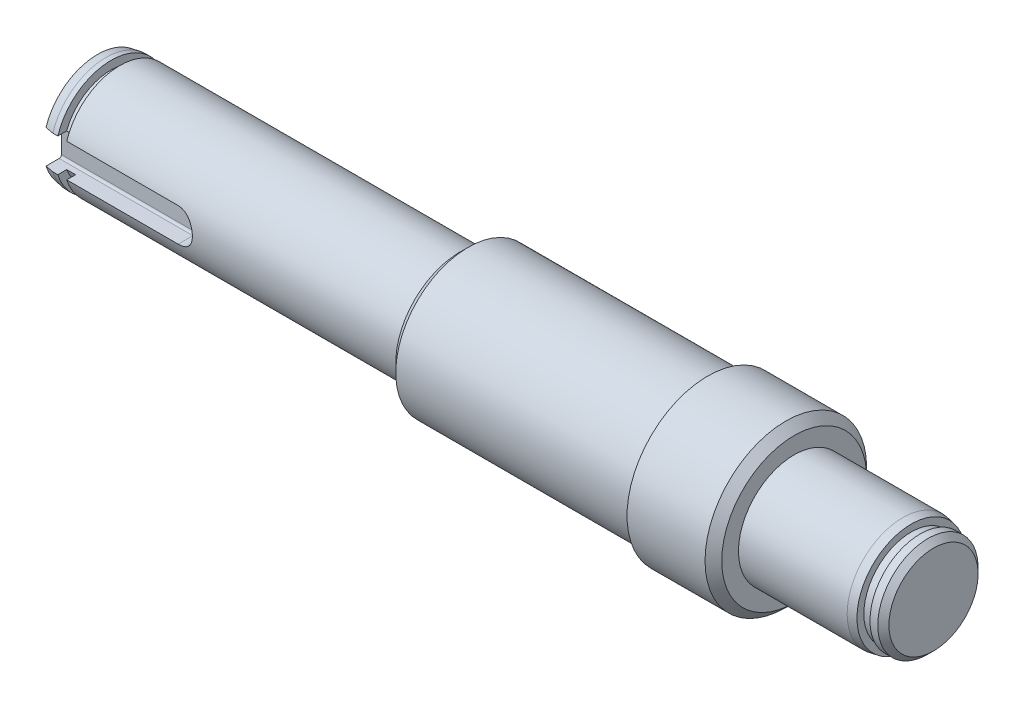
ISO-10303-21;
HEADER;
FILE_DESCRIPTION(('STEP AP214'),'2;1');
FILE_NAME('part.step','',(''),(''),'','','');
FILE_SCHEMA(('AUTOMOTIVE_DESIGN { 1 0 10303 214 1 1 1 1 }'));
ENDSEC;
DATA;
#1=APPLICATION_CONTEXT('core data for automotive mechanical design processes');
#2=APPLICATION_PROTOCOL_DEFINITION('international standard','automotive_design',2000,#1);
#3=PRODUCT_CONTEXT('',#1,'mechanical');
#4=PRODUCT('Part','Part','',(#3));
#5=PRODUCT_RELATED_PRODUCT_CATEGORY('part','',(#4));
#6=PRODUCT_DEFINITION_FORMATION('','',#4);
#7=PRODUCT_DEFINITION_CONTEXT('part definition',#1,'design');
#8=PRODUCT_DEFINITION('design','',#6,#7);
#9=PRODUCT_DEFINITION_SHAPE('','',#8);
#10=(LENGTH_UNIT() NAMED_UNIT(*) SI_UNIT(.MILLI.,.METRE.));
#11=(NAMED_UNIT(*) PLANE_ANGLE_UNIT() SI_UNIT($,.RADIAN.));
#12=(NAMED_UNIT(*) SI_UNIT($,.STERADIAN.) SOLID_ANGLE_UNIT());
#13=UNCERTAINTY_MEASURE_WITH_UNIT(LENGTH_MEASURE(1.E-05),#10,'distance_accuracy_value','');
#14=(GEOMETRIC_REPRESENTATION_CONTEXT(3) GLOBAL_UNCERTAINTY_ASSIGNED_CONTEXT((#13)) GLOBAL_UNIT_ASSIGNED_CONTEXT((#10,
#11,#12)) REPRESENTATION_CONTEXT('',''));
#15=CARTESIAN_POINT('',(0.,0.,0.));
#16=DIRECTION('',(0.,0.,1.));
#17=DIRECTION('',(1.,0.,0.));
#18=AXIS2_PLACEMENT_3D('',#15,#16,#17);
#19=CARTESIAN_POINT('',(30.,13.,0.));
#20=DIRECTION('',(-1.,0.,0.));
#21=DIRECTION('',(0.,0.,1.));
#22=AXIS2_PLACEMENT_3D('',#19,#20,#21);
#23=PLANE('',#22);
#24=CARTESIAN_POINT('',(30.,0.,0.));
#25=DIRECTION('',(-1.,0.,0.));
#26=DIRECTION('',(0.,0.,1.));
#27=AXIS2_PLACEMENT_3D('',#24,#25,#26);
#28=CIRCLE('',#27,13.);
#29=CARTESIAN_POINT('',(30.,0.,13.));
#30=VERTEX_POINT('',#29);
#31=EDGE_CURVE('E299',#30,#30,#28,.F.);
#32=ORIENTED_EDGE('',*,*,#31,.T.);
#33=EDGE_LOOP('',(#32));
#34=FACE_BOUND('',#33,.T.);
#35=CARTESIAN_POINT('',(30.,0.,0.));
#36=DIRECTION('',(-1.,0.,0.));
#37=DIRECTION('',(0.,0.,1.));
#38=AXIS2_PLACEMENT_3D('',#35,#36,#37);
#39=CIRCLE('',#38,10.);
#40=CARTESIAN_POINT('',(30.,0.,10.));
#41=VERTEX_POINT('',#40);
#42=EDGE_CURVE('E238',#41,#41,#39,.T.);
#43=ORIENTED_EDGE('',*,*,#42,.T.);
#44=EDGE_LOOP('',(#43));
#45=FACE_BOUND('',#44,.T.);
#46=ADVANCED_FACE('F38',(#34,#45),#23,.F.);
#47=CARTESIAN_POINT('',(0.,0.,0.));
#48=DIRECTION('',(-1.,0.,0.));
#49=DIRECTION('',(0.,0.,1.));
#50=AXIS2_PLACEMENT_3D('',#47,#48,#49);
#51=CYLINDRICAL_SURFACE('',#50,10.);
#52=CARTESIAN_POINT('',(49.5,0.,0.));
#53=DIRECTION('',(-1.,0.,0.));
#54=DIRECTION('',(0.,0.,1.));
#55=AXIS2_PLACEMENT_3D('',#52,#53,#54);
#56=CIRCLE('',#55,10.);
#57=CARTESIAN_POINT('',(49.5,0.,10.));
#58=VERTEX_POINT('',#57);
#59=EDGE_CURVE('E241',#58,#58,#56,.T.);
#60=ORIENTED_EDGE('',*,*,#59,.T.);
#61=EDGE_LOOP('',(#60));
#62=FACE_BOUND('',#61,.T.);
#63=ORIENTED_EDGE('',*,*,#42,.F.);
#64=EDGE_LOOP('',(#63));
#65=FACE_BOUND('',#64,.T.);
#66=ADVANCED_FACE('F337',(#62,#65),#51,.T.);
#67=CARTESIAN_POINT('',(51.,10.,0.));
#68=DIRECTION('',(-1.,0.,0.));
#69=DIRECTION('',(0.,0.,1.));
#70=AXIS2_PLACEMENT_3D('',#67,#68,#69);
#71=PLANE('',#70);
#72=CARTESIAN_POINT('',(51.,0.,0.));
#73=DIRECTION('',(-1.,0.,0.));
#74=DIRECTION('',(0.,0.,1.));
#75=AXIS2_PLACEMENT_3D('',#72,#73,#74);
#76=CIRCLE('',#75,9.73550952893732);
#77=CARTESIAN_POINT('',(51.,0.,9.73550952893732));
#78=VERTEX_POINT('',#77);
#79=EDGE_CURVE('E244',#78,#78,#76,.F.);
#80=ORIENTED_EDGE('',*,*,#79,.T.);
#81=EDGE_LOOP('',(#80));
#82=FACE_BOUND('',#81,.T.);
#83=CARTESIAN_POINT('',(51.,0.,0.));
#84=DIRECTION('',(-1.,0.,0.));
#85=DIRECTION('',(0.,0.,1.));
#86=AXIS2_PLACEMENT_3D('',#83,#84,#85);
#87=CIRCLE('',#86,8.5);
#88=CARTESIAN_POINT('',(51.,0.,8.5));
#89=VERTEX_POINT('',#88);
#90=EDGE_CURVE('E227',#89,#89,#87,.T.);
#91=ORIENTED_EDGE('',*,*,#90,.T.);
#92=EDGE_LOOP('',(#91));
#93=FACE_BOUND('',#92,.T.);
#94=ADVANCED_FACE('F343',(#82,#93),#71,.F.);
#95=CARTESIAN_POINT('',(49.5,0.,0.));
#96=DIRECTION('',(-1.,0.,0.));
#97=DIRECTION('',(0.,0.,1.));
#98=AXIS2_PLACEMENT_3D('',#95,#96,#97);
#99=CONICAL_SURFACE('',#98,10.,0.174532925199429);
#100=ORIENTED_EDGE('',*,*,#79,.F.);
#101=EDGE_LOOP('',(#100));
#102=FACE_BOUND('',#101,.T.);
#103=ORIENTED_EDGE('',*,*,#59,.F.);
#104=EDGE_LOOP('',(#103));
#105=FACE_BOUND('',#104,.T.);
#106=ADVANCED_FACE('F355',(#102,#105),#99,.T.);
#107=CARTESIAN_POINT('',(52.6,0.,-8.5));
#108=DIRECTION('',(-1.,0.,0.));
#109=DIRECTION('',(0.,0.,1.));
#110=AXIS2_PLACEMENT_3D('',#107,#108,#109);
#111=PLANE('',#110);
#112=CARTESIAN_POINT('',(52.6,0.,0.));
#113=DIRECTION('',(-1.,0.,0.));
#114=DIRECTION('',(0.,0.,1.));
#115=AXIS2_PLACEMENT_3D('',#112,#113,#114);
#116=CIRCLE('',#115,8.5);
#117=CARTESIAN_POINT('',(52.6,0.,8.5));
#118=VERTEX_POINT('',#117);
#119=EDGE_CURVE('E230',#118,#118,#116,.T.);
#120=ORIENTED_EDGE('',*,*,#119,.F.);
#121=EDGE_LOOP('',(#120));
#122=FACE_BOUND('',#121,.T.);
#123=CARTESIAN_POINT('',(52.6,0.,0.));
#124=DIRECTION('',(-1.,0.,0.));
#125=DIRECTION('',(0.,0.,1.));
#126=AXIS2_PLACEMENT_3D('',#123,#124,#125);
#127=CIRCLE('',#126,9.);
#128=CARTESIAN_POINT('',(52.6,0.,9.));
#129=VERTEX_POINT('',#128);
#130=EDGE_CURVE('E234',#129,#129,#127,.T.);
#131=ORIENTED_EDGE('',*,*,#130,.T.);
#132=EDGE_LOOP('',(#131));
#133=FACE_BOUND('',#132,.T.);
#134=ADVANCED_FACE('F359',(#122,#133),#111,.T.);
#135=CARTESIAN_POINT('',(0.,0.,0.));
#136=DIRECTION('',(-1.,0.,0.));
#137=DIRECTION('',(0.,0.,1.));
#138=AXIS2_PLACEMENT_3D('',#135,#136,#137);
#139=CYLINDRICAL_SURFACE('',#138,8.5);
#140=ORIENTED_EDGE('',*,*,#119,.T.);
#141=EDGE_LOOP('',(#140));
#142=FACE_BOUND('',#141,.T.);
#143=ORIENTED_EDGE('',*,*,#90,.F.);
#144=EDGE_LOOP('',(#143));
#145=FACE_BOUND('',#144,.T.);
#146=ADVANCED_FACE('F365',(#142,#145),#139,.T.);
#147=CARTESIAN_POINT('',(55.,9.,0.));
#148=DIRECTION('',(-1.,0.,0.));
#149=DIRECTION('',(0.,0.,1.));
#150=AXIS2_PLACEMENT_3D('',#147,#148,#149);
#151=PLANE('',#150);
#152=CARTESIAN_POINT('',(55.,0.,0.));
#153=DIRECTION('',(-1.,0.,0.));
#154=DIRECTION('',(0.,0.,1.));
#155=AXIS2_PLACEMENT_3D('',#152,#153,#154);
#156=CIRCLE('',#155,8.00000000000002);
#157=CARTESIAN_POINT('',(55.,0.,8.00000000000002));
#158=VERTEX_POINT('',#157);
#159=EDGE_CURVE('E250',#158,#158,#156,.F.);
#160=ORIENTED_EDGE('',*,*,#159,.T.);
#161=EDGE_LOOP('',(#160));
#162=FACE_BOUND('',#161,.T.);
#163=ADVANCED_FACE('F377',(#162),#151,.F.);
#164=CARTESIAN_POINT('',(54.,0.,0.));
#165=DIRECTION('',(-1.,0.,0.));
#166=DIRECTION('',(0.,0.,1.));
#167=AXIS2_PLACEMENT_3D('',#164,#165,#166);
#168=CONICAL_SURFACE('',#167,9.,0.785398163397454);
#169=ORIENTED_EDGE('',*,*,#159,.F.);
#170=EDGE_LOOP('',(#169));
#171=FACE_BOUND('',#170,.T.);
#172=CARTESIAN_POINT('',(54.,0.,0.));
#173=DIRECTION('',(-1.,0.,0.));
#174=DIRECTION('',(0.,0.,1.));
#175=AXIS2_PLACEMENT_3D('',#172,#173,#174);
#176=CIRCLE('',#175,9.);
#177=CARTESIAN_POINT('',(54.,0.,9.));
#178=VERTEX_POINT('',#177);
#179=EDGE_CURVE('E247',#178,#178,#176,.T.);
#180=ORIENTED_EDGE('',*,*,#179,.F.);
#181=EDGE_LOOP('',(#180));
#182=FACE_BOUND('',#181,.T.);
#183=ADVANCED_FACE('F198',(#171,#182),#168,.T.);
#184=CARTESIAN_POINT('',(0.,0.,0.));
#185=DIRECTION('',(-1.,0.,0.));
#186=DIRECTION('',(0.,0.,1.));
#187=AXIS2_PLACEMENT_3D('',#184,#185,#186);
#188=CYLINDRICAL_SURFACE('',#187,9.);
#189=ORIENTED_EDGE('',*,*,#179,.T.);
#190=EDGE_LOOP('',(#189));
#191=FACE_BOUND('',#190,.T.);
#192=ORIENTED_EDGE('',*,*,#130,.F.);
#193=EDGE_LOOP('',(#192));
#194=FACE_BOUND('',#193,.T.);
#195=ADVANCED_FACE('F411',(#191,#194),#188,.T.);
#196=CARTESIAN_POINT('',(14.5,0.,0.));
#197=DIRECTION('',(1.,0.,0.));
#198=DIRECTION('',(0.,0.,-1.));
#199=AXIS2_PLACEMENT_3D('',#196,#197,#198);
#200=CYLINDRICAL_SURFACE('',#199,14.5);
#201=CARTESIAN_POINT('',(28.5,0.,0.));
#202=DIRECTION('',(-1.,0.,0.));
#203=DIRECTION('',(0.,0.,1.));
#204=AXIS2_PLACEMENT_3D('',#201,#202,#203);
#205=CIRCLE('',#204,14.5);
#206=CARTESIAN_POINT('',(28.5,0.,14.5));
#207=VERTEX_POINT('',#206);
#208=EDGE_CURVE('E294',#207,#207,#205,.T.);
#209=ORIENTED_EDGE('',*,*,#208,.T.);
#210=EDGE_LOOP('',(#209));
#211=FACE_BOUND('',#210,.T.);
#212=CARTESIAN_POINT('',(14.5,0.,0.));
#213=DIRECTION('',(1.,0.,0.));
#214=DIRECTION('',(0.,0.,-1.));
#215=AXIS2_PLACEMENT_3D('',#212,#213,#214);
#216=CIRCLE('',#215,14.5);
#217=CARTESIAN_POINT('',(14.5,0.,-14.5));
#218=VERTEX_POINT('',#217);
#219=EDGE_CURVE('E128',#218,#218,#216,.T.);
#220=ORIENTED_EDGE('',*,*,#219,.T.);
#221=EDGE_LOOP('',(#220));
#222=FACE_BOUND('',#221,.T.);
#223=ADVANCED_FACE('F332',(#211,#222),#200,.T.);
#224=CARTESIAN_POINT('',(14.5,0.,0.));
#225=DIRECTION('',(1.,0.,0.));
#226=DIRECTION('',(0.,0.,-1.));
#227=AXIS2_PLACEMENT_3D('',#224,#225,#226);
#228=PLANE('',#227);
#229=CARTESIAN_POINT('',(14.5,0.,0.));
#230=DIRECTION('',(1.,0.,0.));
#231=DIRECTION('',(0.,0.,-1.));
#232=AXIS2_PLACEMENT_3D('',#229,#230,#231);
#233=CIRCLE('',#232,13.);
#234=CARTESIAN_POINT('',(14.5,0.,-13.));
#235=VERTEX_POINT('',#234);
#236=EDGE_CURVE('E600',#235,#235,#233,.T.);
#237=ORIENTED_EDGE('',*,*,#236,.T.);
#238=EDGE_LOOP('',(#237));
#239=FACE_BOUND('',#238,.T.);
#240=ORIENTED_EDGE('',*,*,#219,.F.);
#241=EDGE_LOOP('',(#240));
#242=FACE_BOUND('',#241,.T.);
#243=ADVANCED_FACE('F326',(#239,#242),#228,.F.);
#244=CARTESIAN_POINT('',(-119.,0.,6.5));
#245=DIRECTION('',(0.,0.,1.));
#246=DIRECTION('',(1.,0.,0.));
#247=AXIS2_PLACEMENT_3D('',#244,#245,#246);
#248=PLANE('',#247);
#249=CARTESIAN_POINT('',(-71.,0.,6.5));
#250=DIRECTION('',(0.,0.,1.));
#251=DIRECTION('',(1.,0.,0.));
#252=AXIS2_PLACEMENT_3D('',#249,#250,#251);
#253=CIRCLE('',#252,2.6);
#254=CARTESIAN_POINT('',(-71.,-2.59999999999999,6.5));
#255=VERTEX_POINT('',#254);
#256=CARTESIAN_POINT('',(-71.,2.6,6.5));
#257=VERTEX_POINT('',#256);
#258=EDGE_CURVE('E293',#255,#257,#253,.T.);
#259=ORIENTED_EDGE('',*,*,#258,.T.);
#260=DIRECTION('',(-1.,0.,0.));
#261=VECTOR('',#260,1.);
#262=CARTESIAN_POINT('',(-119.,2.6,6.5));
#263=LINE('',#262,#261);
#264=CARTESIAN_POINT('',(-95.,2.6,6.5));
#265=VERTEX_POINT('',#264);
#266=EDGE_CURVE('E296',#257,#265,#263,.T.);
#267=ORIENTED_EDGE('',*,*,#266,.T.);
#268=DIRECTION('',(0.,-1.,0.));
#269=VECTOR('',#268,1.);
#270=CARTESIAN_POINT('',(-95.,0.,6.5));
#271=LINE('',#270,#269);
#272=CARTESIAN_POINT('',(-95.,-2.6,6.5));
#273=VERTEX_POINT('',#272);
#274=EDGE_CURVE('E143',#265,#273,#271,.T.);
#275=ORIENTED_EDGE('',*,*,#274,.T.);
#276=DIRECTION('',(1.,0.,0.));
#277=VECTOR('',#276,1.);
#278=CARTESIAN_POINT('',(-119.,-2.6,6.5));
#279=LINE('',#278,#277);
#280=EDGE_CURVE('E290',#273,#255,#279,.T.);
#281=ORIENTED_EDGE('',*,*,#280,.T.);
#282=EDGE_LOOP('',(#259,#267,#275,#281));
#283=FACE_BOUND('',#282,.T.);
#284=ADVANCED_FACE('F324',(#283),#248,.T.);
#285=CARTESIAN_POINT('',(-95.,0.,0.));
#286=DIRECTION('',(1.,0.,0.));
#287=DIRECTION('',(0.,0.,-1.));
#288=AXIS2_PLACEMENT_3D('',#285,#286,#287);
#289=PLANE('',#288);
#290=ORIENTED_EDGE('',*,*,#274,.F.);
#291=CARTESIAN_POINT('',(-95.,2.6,6.9));
#292=DIRECTION('',(1.,0.,0.));
#293=DIRECTION('',(0.,0.,-1.));
#294=AXIS2_PLACEMENT_3D('',#291,#292,#293);
#295=CIRCLE('',#294,0.4);
#296=CARTESIAN_POINT('',(-95.,3.,6.9));
#297=VERTEX_POINT('',#296);
#298=EDGE_CURVE('E47',#265,#297,#295,.T.);
#299=ORIENTED_EDGE('',*,*,#298,.T.);
#300=DIRECTION('',(0.,0.,1.));
#301=VECTOR('',#300,1.);
#302=CARTESIAN_POINT('',(-95.,3.,0.));
#303=LINE('',#302,#301);
#304=CARTESIAN_POINT('',(-95.,3.,9.26175716524833));
#305=VERTEX_POINT('',#304);
#306=EDGE_CURVE('E210',#297,#305,#303,.T.);
#307=ORIENTED_EDGE('',*,*,#306,.T.);
#308=CARTESIAN_POINT('',(-95.,0.,0.));
#309=DIRECTION('',(1.,0.,0.));
#310=DIRECTION('',(0.,0.,-1.));
#311=AXIS2_PLACEMENT_3D('',#308,#309,#310);
#312=CIRCLE('',#311,9.73550952893729);
#313=CARTESIAN_POINT('',(-95.,-3.,9.26175716524833));
#314=VERTEX_POINT('',#313);
#315=EDGE_CURVE('E258',#305,#314,#312,.F.);
#316=ORIENTED_EDGE('',*,*,#315,.T.);
#317=DIRECTION('',(0.,0.,-1.));
#318=VECTOR('',#317,1.);
#319=CARTESIAN_POINT('',(-95.,-3.,0.));
#320=LINE('',#319,#318);
#321=CARTESIAN_POINT('',(-95.,-3.,6.9));
#322=VERTEX_POINT('',#321);
#323=EDGE_CURVE('E182',#314,#322,#320,.T.);
#324=ORIENTED_EDGE('',*,*,#323,.T.);
#325=CARTESIAN_POINT('',(-95.,-2.6,6.9));
#326=DIRECTION('',(1.,0.,0.));
#327=DIRECTION('',(0.,0.,-1.));
#328=AXIS2_PLACEMENT_3D('',#325,#326,#327);
#329=CIRCLE('',#328,0.4);
#330=EDGE_CURVE('E11',#322,#273,#329,.T.);
#331=ORIENTED_EDGE('',*,*,#330,.T.);
#332=EDGE_LOOP('',(#290,#299,#307,#316,#324,#331));
#333=FACE_BOUND('',#332,.T.);
#334=ADVANCED_FACE('F196',(#333),#289,.F.);
#335=CARTESIAN_POINT('',(-93.4999999999999,0.,0.));
#336=DIRECTION('',(1.,0.,0.));
#337=DIRECTION('',(0.,0.,-1.));
#338=AXIS2_PLACEMENT_3D('',#335,#336,#337);
#339=CONICAL_SURFACE('',#338,10.,0.174532925199432);
#340=CARTESIAN_POINT('',(-89.6919134470679,3.,10.2411053066004));
#341=CARTESIAN_POINT('',(-90.4517871921388,3.,10.1014867502676));
#342=CARTESIAN_POINT('',(-91.2116215065538,3.,9.96165336417258));
#343=CARTESIAN_POINT('',(-92.7311983280005,3.,9.68149106892396));
#344=CARTESIAN_POINT('',(-93.4909408350836,3.,9.54116216004859));
#345=CARTESIAN_POINT('',(-95.0103220468843,3.,9.25994278097413));
#346=CARTESIAN_POINT('',(-95.7699607515885,3.,9.11905231070269));
#347=CARTESIAN_POINT('',(-97.2891180259019,3.,8.83662286923871));
#348=CARTESIAN_POINT('',(-98.0486365954433,3.,8.69508389768165));
#349=CARTESIAN_POINT('',(-98.808086552932,3.,8.55317727582825));
#350=B_SPLINE_CURVE_WITH_KNOTS('',3,(#340,#341,#342,#343,#344,#345,#346,#347,#348,#349),
.UNSPECIFIED.,.F.,.F.,(4,2,2,2,4),(0.,2.317781951926,4.63556260261364,6.95334355184208,
9.27112580401251),.UNSPECIFIED.);
#351=CARTESIAN_POINT('',(-93.4999999999999,3.00000000000001,9.53939201416945));
#352=VERTEX_POINT('',#351);
#353=EDGE_CURVE('E138',#352,#305,#350,.T.);
#354=ORIENTED_EDGE('',*,*,#353,.F.);
#355=CARTESIAN_POINT('',(-93.4999999999999,0.,0.));
#356=DIRECTION('',(1.,0.,0.));
#357=DIRECTION('',(0.,0.,-1.));
#358=AXIS2_PLACEMENT_3D('',#355,#356,#357);
#359=CIRCLE('',#358,10.);
#360=CARTESIAN_POINT('',(-93.4999999999999,-2.99999999999998,9.53939201416946));
#361=VERTEX_POINT('',#360);
#362=EDGE_CURVE('E253',#361,#352,#359,.T.);
#363=ORIENTED_EDGE('',*,*,#362,.F.);
#364=CARTESIAN_POINT('',(-98.808086552932,-3.,8.55317727582824));
#365=CARTESIAN_POINT('',(-98.0486365954433,-3.,8.69508389768165));
#366=CARTESIAN_POINT('',(-97.2891180259019,-3.,8.83662286923871));
#367=CARTESIAN_POINT('',(-95.7699607515885,-3.,9.1190523107027));
#368=CARTESIAN_POINT('',(-95.0103220468843,-3.,9.25994278097413));
#369=CARTESIAN_POINT('',(-93.4909408350836,-3.,9.5411621600486));
#370=CARTESIAN_POINT('',(-92.7311983280005,-3.,9.68149106892396));
#371=CARTESIAN_POINT('',(-91.2116215065538,-3.,9.96165336417258));
#372=CARTESIAN_POINT('',(-90.4517871921388,-3.,10.1014867502676));
#373=CARTESIAN_POINT('',(-89.6919134470679,-3.,10.2411053066004));
#374=B_SPLINE_CURVE_WITH_KNOTS('',3,(#364,#365,#366,#367,#368,#369,#370,#371,#372,#373),
.UNSPECIFIED.,.F.,.F.,(4,2,2,2,4),(0.,2.31778225217043,4.63556320139887,6.95334385208651,
9.27112580401251),.UNSPECIFIED.);
#375=EDGE_CURVE('E175',#314,#361,#374,.T.);
#376=ORIENTED_EDGE('',*,*,#375,.F.);
#377=ORIENTED_EDGE('',*,*,#315,.F.);
#378=EDGE_LOOP('',(#354,#363,#376,#377));
#379=FACE_BOUND('',#378,.T.);
#380=ADVANCED_FACE('F186',(#379),#339,.T.);
#381=CARTESIAN_POINT('',(0.,0.,0.));
#382=DIRECTION('',(1.,0.,0.));
#383=DIRECTION('',(0.,0.,1.));
#384=AXIS2_PLACEMENT_3D('',#381,#382,#383);
#385=CYLINDRICAL_SURFACE('',#384,10.);
#386=ORIENTED_EDGE('',*,*,#362,.T.);
#387=DIRECTION('',(1.,0.,0.));
#388=VECTOR('',#387,1.);
#389=CARTESIAN_POINT('',(0.,3.00000000000001,9.53939201416945));
#390=LINE('',#389,#388);
#391=CARTESIAN_POINT('',(-92.6,3.00000000000001,9.53939201416945));
#392=VERTEX_POINT('',#391);
#393=EDGE_CURVE('E149',#352,#392,#390,.T.);
#394=ORIENTED_EDGE('',*,*,#393,.T.);
#395=CARTESIAN_POINT('',(-92.6,0.,0.));
#396=DIRECTION('',(1.,0.,0.));
#397=DIRECTION('',(0.,0.,-1.));
#398=AXIS2_PLACEMENT_3D('',#395,#396,#397);
#399=CIRCLE('',#398,10.);
#400=CARTESIAN_POINT('',(-92.6,-2.99999999999998,9.53939201416946));
#401=VERTEX_POINT('',#400);
#402=EDGE_CURVE('E226',#401,#392,#399,.T.);
#403=ORIENTED_EDGE('',*,*,#402,.F.);
#404=DIRECTION('',(1.,0.,0.));
#405=VECTOR('',#404,1.);
#406=CARTESIAN_POINT('',(0.,-2.99999999999998,9.53939201416946));
#407=LINE('',#406,#405);
#408=EDGE_CURVE('E261',#401,#361,#407,.F.);
#409=ORIENTED_EDGE('',*,*,#408,.T.);
#410=EDGE_LOOP('',(#386,#394,#403,#409));
#411=FACE_BOUND('',#410,.T.);
#412=ADVANCED_FACE('F195',(#411),#385,.T.);
#413=CARTESIAN_POINT('',(-92.6,0.,-8.5));
#414=DIRECTION('',(1.,0.,0.));
#415=DIRECTION('',(0.,0.,1.));
#416=AXIS2_PLACEMENT_3D('',#413,#414,#415);
#417=PLANE('',#416);
#418=DIRECTION('',(0.,0.,1.));
#419=VECTOR('',#418,1.);
#420=CARTESIAN_POINT('',(-92.6,3.,-8.5));
#421=LINE('',#420,#419);
#422=CARTESIAN_POINT('',(-92.6,3.,7.95298686029343));
#423=VERTEX_POINT('',#422);
#424=EDGE_CURVE('E213',#423,#392,#421,.T.);
#425=ORIENTED_EDGE('',*,*,#424,.F.);
#426=CARTESIAN_POINT('',(-92.6,0.,0.));
#427=DIRECTION('',(-1.,0.,0.));
#428=DIRECTION('',(0.,0.,1.));
#429=AXIS2_PLACEMENT_3D('',#426,#427,#428);
#430=CIRCLE('',#429,8.5);
#431=CARTESIAN_POINT('',(-92.6,-3.,7.95298686029344));
#432=VERTEX_POINT('',#431);
#433=EDGE_CURVE('E223',#423,#432,#430,.T.);
#434=ORIENTED_EDGE('',*,*,#433,.T.);
#435=DIRECTION('',(0.,0.,-1.));
#436=VECTOR('',#435,1.);
#437=CARTESIAN_POINT('',(-92.6,-3.,-8.5));
#438=LINE('',#437,#436);
#439=EDGE_CURVE('E277',#401,#432,#438,.T.);
#440=ORIENTED_EDGE('',*,*,#439,.F.);
#441=ORIENTED_EDGE('',*,*,#402,.T.);
#442=EDGE_LOOP('',(#425,#434,#440,#441));
#443=FACE_BOUND('',#442,.T.);
#444=ADVANCED_FACE('F275',(#443),#417,.T.);
#445=CARTESIAN_POINT('',(-40.,0.,0.));
#446=DIRECTION('',(1.,0.,0.));
#447=DIRECTION('',(0.,0.,1.));
#448=AXIS2_PLACEMENT_3D('',#445,#446,#447);
#449=CYLINDRICAL_SURFACE('',#448,8.5);
#450=DIRECTION('',(1.,0.,0.));
#451=VECTOR('',#450,1.);
#452=CARTESIAN_POINT('',(-40.,3.00000000000001,7.95298686029343));
#453=LINE('',#452,#451);
#454=CARTESIAN_POINT('',(-91.,3.00000000000001,7.95298686029343));
#455=VERTEX_POINT('',#454);
#456=EDGE_CURVE('E215',#455,#423,#453,.F.);
#457=ORIENTED_EDGE('',*,*,#456,.F.);
#458=CARTESIAN_POINT('',(-91.,0.,0.));
#459=DIRECTION('',(-1.,0.,0.));
#460=DIRECTION('',(0.,0.,1.));
#461=AXIS2_PLACEMENT_3D('',#458,#459,#460);
#462=CIRCLE('',#461,8.5);
#463=CARTESIAN_POINT('',(-91.,-2.99999999999999,7.95298686029344));
#464=VERTEX_POINT('',#463);
#465=EDGE_CURVE('E220',#455,#464,#462,.T.);
#466=ORIENTED_EDGE('',*,*,#465,.T.);
#467=DIRECTION('',(1.,0.,0.));
#468=VECTOR('',#467,1.);
#469=CARTESIAN_POINT('',(-40.,-2.99999999999999,7.95298686029344));
#470=LINE('',#469,#468);
#471=EDGE_CURVE('E279',#432,#464,#470,.T.);
#472=ORIENTED_EDGE('',*,*,#471,.F.);
#473=ORIENTED_EDGE('',*,*,#433,.F.);
#474=EDGE_LOOP('',(#457,#466,#472,#473));
#475=FACE_BOUND('',#474,.T.);
#476=ADVANCED_FACE('F172',(#475),#449,.T.);
#477=CARTESIAN_POINT('',(-119.,-3.,6.5));
#478=DIRECTION('',(0.,-1.,0.));
#479=DIRECTION('',(1.,0.,0.));
#480=AXIS2_PLACEMENT_3D('',#477,#478,#479);
#481=PLANE('',#480);
#482=DIRECTION('',(0.,0.,1.));
#483=VECTOR('',#482,1.);
#484=CARTESIAN_POINT('',(-71.,-3.,6.5));
#485=LINE('',#484,#483);
#486=CARTESIAN_POINT('',(-71.,-3.,6.9));
#487=VERTEX_POINT('',#486);
#488=CARTESIAN_POINT('',(-71.,-3.,9.53939201416946));
#489=VERTEX_POINT('',#488);
#490=EDGE_CURVE('E121',#487,#489,#485,.T.);
#491=ORIENTED_EDGE('',*,*,#490,.F.);
#492=DIRECTION('',(1.,0.,0.));
#493=VECTOR('',#492,1.);
#494=CARTESIAN_POINT('',(-119.,-3.,6.9));
#495=LINE('',#494,#493);
#496=EDGE_CURVE('E55',#487,#322,#495,.F.);
#497=ORIENTED_EDGE('',*,*,#496,.T.);
#498=ORIENTED_EDGE('',*,*,#323,.F.);
#499=ORIENTED_EDGE('',*,*,#375,.T.);
#500=ORIENTED_EDGE('',*,*,#408,.F.);
#501=ORIENTED_EDGE('',*,*,#439,.T.);
#502=ORIENTED_EDGE('',*,*,#471,.T.);
#503=DIRECTION('',(0.,0.,1.));
#504=VECTOR('',#503,1.);
#505=CARTESIAN_POINT('',(-91.,-3.,-8.5));
#506=LINE('',#505,#504);
#507=CARTESIAN_POINT('',(-91.,-3.,9.53939201416946));
#508=VERTEX_POINT('',#507);
#509=EDGE_CURVE('E134',#464,#508,#506,.T.);
#510=ORIENTED_EDGE('',*,*,#509,.T.);
#511=DIRECTION('',(1.,0.,0.));
#512=VECTOR('',#511,1.);
#513=CARTESIAN_POINT('',(0.,-2.99999999999998,9.53939201416946));
#514=LINE('',#513,#512);
#515=EDGE_CURVE('E131',#489,#508,#514,.F.);
#516=ORIENTED_EDGE('',*,*,#515,.F.);
#517=EDGE_LOOP('',(#491,#497,#498,#499,#500,#501,#502,#510,#516));
#518=FACE_BOUND('',#517,.T.);
#519=ADVANCED_FACE('F132',(#518),#481,.F.);
#520=CARTESIAN_POINT('',(-71.,0.,6.5));
#521=DIRECTION('',(0.,0.,1.));
#522=DIRECTION('',(1.,0.,0.));
#523=AXIS2_PLACEMENT_3D('',#520,#521,#522);
#524=CYLINDRICAL_SURFACE('',#523,3.);
#525=DIRECTION('',(0.,0.,1.));
#526=VECTOR('',#525,1.);
#527=CARTESIAN_POINT('',(-71.,3.00000000000001,6.5));
#528=LINE('',#527,#526);
#529=CARTESIAN_POINT('',(-71.,3.00000000000001,6.9));
#530=VERTEX_POINT('',#529);
#531=CARTESIAN_POINT('',(-71.,3.00000000000001,9.53939201416945));
#532=VERTEX_POINT('',#531);
#533=EDGE_CURVE('E127',#530,#532,#528,.T.);
#534=ORIENTED_EDGE('',*,*,#533,.F.);
#535=CARTESIAN_POINT('',(-71.,0.,6.9));
#536=DIRECTION('',(0.,0.,1.));
#537=DIRECTION('',(1.,0.,0.));
#538=AXIS2_PLACEMENT_3D('',#535,#536,#537);
#539=CIRCLE('',#538,3.);
#540=EDGE_CURVE('E63',#530,#487,#539,.F.);
#541=ORIENTED_EDGE('',*,*,#540,.T.);
#542=ORIENTED_EDGE('',*,*,#490,.T.);
#543=CARTESIAN_POINT('',(-71.,3.,9.53939201416946));
#544=CARTESIAN_POINT('',(-70.9176644791773,3.00001027845728,9.53938054248207));
#545=CARTESIAN_POINT('',(-70.8353355449368,2.99661062684472,9.54045772064378));
#546=CARTESIAN_POINT('',(-70.6713060472345,2.98307142899347,9.54470412105986));
#547=CARTESIAN_POINT('',(-70.5896053466756,2.97293339805418,9.54787287296849));
#548=CARTESIAN_POINT('',(-70.4276150843268,2.94603140625045,9.55620668351003));
#549=CARTESIAN_POINT('',(-70.347322475957,2.92928426957737,9.56136667250114));
#550=CARTESIAN_POINT('',(-70.1885241558658,2.88932853030395,9.57351626651178));
#551=CARTESIAN_POINT('',(-70.1100184909326,2.8661197587264,9.58050591937828));
#552=CARTESIAN_POINT('',(-69.8780506120099,2.78708584446024,9.60391637654136));
#553=CARTESIAN_POINT('',(-69.727931561167,2.72181852542973,9.62279007830391));
#554=CARTESIAN_POINT('',(-69.440773956021,2.56815043531276,9.66493213967819));
#555=CARTESIAN_POINT('',(-69.3037415292378,2.4797388992416,9.68820254290641));
#556=CARTESIAN_POINT('',(-69.0422770120522,2.27929879634443,9.73733650515374));
#557=CARTESIAN_POINT('',(-68.9183151259391,2.16666914746584,9.76325505469874));
#558=CARTESIAN_POINT('',(-68.6907263851612,1.92227736150433,9.81429628475077));
#559=CARTESIAN_POINT('',(-68.587102966139,1.79051199848164,9.8394188301941));
#560=CARTESIAN_POINT('',(-68.4010731349055,1.50821997465697,9.88666477976534));
#561=CARTESIAN_POINT('',(-68.3191498202174,1.35736167401015,9.90871541546877));
#562=CARTESIAN_POINT('',(-68.1820229959971,1.04324233568302,9.94668940088144));
#563=CARTESIAN_POINT('',(-68.1268125966321,0.879984508687984,9.96261433032403));
#564=CARTESIAN_POINT('',(-68.046240448209,0.550649404820601,9.98615279768398));
#565=CARTESIAN_POINT('',(-68.0200702964824,0.384786253016201,9.99399098526792));
#566=CARTESIAN_POINT('',(-67.995765304854,0.0508471415689241,10.0012640407204));
#567=CARTESIAN_POINT('',(-67.9976251573218,-0.117228393125343,10.0007004995012));
#568=CARTESIAN_POINT('',(-68.0287858206915,-0.445143199271829,9.99139205125586));
#569=CARTESIAN_POINT('',(-68.0572106908081,-0.605074290763033,9.98290831016512));
#570=CARTESIAN_POINT('',(-68.1392632696255,-0.917780104370317,9.95903027401822));
#571=CARTESIAN_POINT('',(-68.1928922986827,-1.07055445110879,9.94363561692558));
#572=CARTESIAN_POINT('',(-68.3244244435247,-1.36669563173912,9.90730429851782));
#573=CARTESIAN_POINT('',(-68.4026032887761,-1.50993201207612,9.88630511384915));
#574=CARTESIAN_POINT('',(-68.5807971800344,-1.781531059161,9.84099249303646));
#575=CARTESIAN_POINT('',(-68.6808171189407,-1.9098903832325,9.81667831471806));
#576=CARTESIAN_POINT('',(-68.9043839761846,-2.15330901082205,9.7662334714278));
#577=CARTESIAN_POINT('',(-69.0286877275262,-2.26766702955975,9.74006890899097));
#578=CARTESIAN_POINT('',(-69.2949948468511,-2.47413538985067,9.68968430229327));
#579=CARTESIAN_POINT('',(-69.4370033607298,-2.56623924026181,9.66546482675133));
#580=CARTESIAN_POINT('',(-69.7365618568999,-2.72632814481702,9.62154457591303));
#581=CARTESIAN_POINT('',(-69.8942543591872,-2.79406012682263,9.60189192491895));
#582=CARTESIAN_POINT('',(-70.2194490079632,-2.90171772009405,9.56991327306402));
#583=CARTESIAN_POINT('',(-70.3869357214287,-2.94168586436072,9.55757606951749));
#584=CARTESIAN_POINT('',(-70.6299897781404,-2.97802407180159,9.54628064650012));
#585=CARTESIAN_POINT('',(-70.7037814683592,-2.98626405978017,9.54370312550533));
#586=CARTESIAN_POINT('',(-70.8517029581991,-2.99724711229708,9.54025857223564));
#587=CARTESIAN_POINT('',(-70.9258320993277,-2.99999825936538,9.53938902493288));
#588=CARTESIAN_POINT('',(-71.,-3.,9.53939201416946));
#589=B_SPLINE_CURVE_WITH_KNOTS('',3,(#543,#544,#545,#546,#547,#548,#549,#550,#551,#552,#553,
#554,#555,#556,#557,#558,#559,#560,#561,#562,#563,#564,#565,#566,#567,#568,#569,#570,#571,#572,
#573,#574,#575,#576,#577,#578,#579,#580,#581,#582,#583,#584,#585,#586,#587,#588),.UNSPECIFIED.,
.F.,.F.,(4,2,2,2,2,2,2,2,2,2,2,2,2,2,2,2,2,2,2,2,2,2,4),(0.,0.246918142439488,0.493780777706094,
0.740019009623012,0.986263681482027,1.47813347402025,1.97023245590778,2.47635119822767,
2.98255536239033,3.4992281062007,4.01576751791672,4.51753600864764,5.01920948804101,
5.50490358251093,5.99062312360832,6.48200583350621,6.9734987373917,7.48389234847122,
7.99443465298715,8.51013494368215,9.02504345105574,9.24774267716777,9.47011372732391),.UNSPECIFIED.);
#590=EDGE_CURVE('E125',#532,#489,#589,.T.);
#591=ORIENTED_EDGE('',*,*,#590,.F.);
#592=EDGE_LOOP('',(#534,#541,#542,#591));
#593=FACE_BOUND('',#592,.T.);
#594=ADVANCED_FACE('F123',(#593),#524,.F.);
#595=CARTESIAN_POINT('',(-119.,3.,6.5));
#596=DIRECTION('',(0.,1.,0.));
#597=DIRECTION('',(-1.,0.,0.));
#598=AXIS2_PLACEMENT_3D('',#595,#596,#597);
#599=PLANE('',#598);
#600=ORIENTED_EDGE('',*,*,#306,.F.);
#601=DIRECTION('',(-1.,0.,0.));
#602=VECTOR('',#601,1.);
#603=CARTESIAN_POINT('',(-119.,3.,6.9));
#604=LINE('',#603,#602);
#605=EDGE_CURVE('E305',#297,#530,#604,.F.);
#606=ORIENTED_EDGE('',*,*,#605,.T.);
#607=ORIENTED_EDGE('',*,*,#533,.T.);
#608=DIRECTION('',(1.,0.,0.));
#609=VECTOR('',#608,1.);
#610=CARTESIAN_POINT('',(0.,3.00000000000001,9.53939201416945));
#611=LINE('',#610,#609);
#612=CARTESIAN_POINT('',(-91.,3.,9.53939201416946));
#613=VERTEX_POINT('',#612);
#614=EDGE_CURVE('E141',#613,#532,#611,.T.);
#615=ORIENTED_EDGE('',*,*,#614,.F.);
#616=DIRECTION('',(0.,0.,-1.));
#617=VECTOR('',#616,1.);
#618=CARTESIAN_POINT('',(-91.,3.,-8.5));
#619=LINE('',#618,#617);
#620=EDGE_CURVE('E217',#613,#455,#619,.T.);
#621=ORIENTED_EDGE('',*,*,#620,.T.);
#622=ORIENTED_EDGE('',*,*,#456,.T.);
#623=ORIENTED_EDGE('',*,*,#424,.T.);
#624=ORIENTED_EDGE('',*,*,#393,.F.);
#625=ORIENTED_EDGE('',*,*,#353,.T.);
#626=EDGE_LOOP('',(#600,#606,#607,#615,#621,#622,#623,#624,#625));
#627=FACE_BOUND('',#626,.T.);
#628=ADVANCED_FACE('F166',(#627),#599,.F.);
#629=CARTESIAN_POINT('',(-91.,0.,-8.5));
#630=DIRECTION('',(-1.,0.,0.));
#631=DIRECTION('',(0.,0.,-1.));
#632=AXIS2_PLACEMENT_3D('',#629,#630,#631);
#633=PLANE('',#632);
#634=ORIENTED_EDGE('',*,*,#620,.F.);
#635=CARTESIAN_POINT('',(-91.,0.,0.));
#636=DIRECTION('',(-1.,0.,0.));
#637=DIRECTION('',(0.,0.,1.));
#638=AXIS2_PLACEMENT_3D('',#635,#636,#637);
#639=CIRCLE('',#638,10.);
#640=EDGE_CURVE('E231',#613,#508,#639,.T.);
#641=ORIENTED_EDGE('',*,*,#640,.T.);
#642=ORIENTED_EDGE('',*,*,#509,.F.);
#643=ORIENTED_EDGE('',*,*,#465,.F.);
#644=EDGE_LOOP('',(#634,#641,#642,#643));
#645=FACE_BOUND('',#644,.T.);
#646=ADVANCED_FACE('F386',(#645),#633,.T.);
#647=CARTESIAN_POINT('',(-30.,0.,0.));
#648=DIRECTION('',(-1.,0.,0.));
#649=DIRECTION('',(0.,0.,1.));
#650=AXIS2_PLACEMENT_3D('',#647,#648,#649);
#651=CIRCLE('',#650,10.);
#652=CARTESIAN_POINT('',(-30.,0.,10.));
#653=VERTEX_POINT('',#652);
#654=EDGE_CURVE('E235',#653,#653,#651,.T.);
#655=ORIENTED_EDGE('',*,*,#654,.T.);
#656=EDGE_LOOP('',(#655));
#657=FACE_BOUND('',#656,.T.);
#658=ORIENTED_EDGE('',*,*,#640,.F.);
#659=ORIENTED_EDGE('',*,*,#614,.T.);
#660=ORIENTED_EDGE('',*,*,#590,.T.);
#661=ORIENTED_EDGE('',*,*,#515,.T.);
#662=EDGE_LOOP('',(#658,#659,#660,#661));
#663=FACE_BOUND('',#662,.T.);
#664=ADVANCED_FACE('F140',(#657,#663),#385,.T.);
#665=CARTESIAN_POINT('',(-30.,13.,0.));
#666=DIRECTION('',(1.,0.,0.));
#667=DIRECTION('',(0.,0.,1.));
#668=AXIS2_PLACEMENT_3D('',#665,#666,#667);
#669=PLANE('',#668);
#670=CARTESIAN_POINT('',(-30.,0.,0.));
#671=DIRECTION('',(1.,0.,0.));
#672=DIRECTION('',(0.,0.,-1.));
#673=AXIS2_PLACEMENT_3D('',#670,#671,#672);
#674=CIRCLE('',#673,11.5);
#675=CARTESIAN_POINT('',(-30.,0.,-11.5));
#676=VERTEX_POINT('',#675);
#677=EDGE_CURVE('E142',#676,#676,#674,.F.);
#678=ORIENTED_EDGE('',*,*,#677,.T.);
#679=EDGE_LOOP('',(#678));
#680=FACE_BOUND('',#679,.T.);
#681=ORIENTED_EDGE('',*,*,#654,.F.);
#682=EDGE_LOOP('',(#681));
#683=FACE_BOUND('',#682,.T.);
#684=ADVANCED_FACE('F398',(#680,#683),#669,.F.);
#685=CARTESIAN_POINT('',(-30.,0.,0.));
#686=DIRECTION('',(1.,0.,0.));
#687=DIRECTION('',(0.,0.,-1.));
#688=AXIS2_PLACEMENT_3D('',#685,#686,#687);
#689=CONICAL_SURFACE('',#688,11.5,0.785398163397442);
#690=CARTESIAN_POINT('',(-28.5,0.,0.));
#691=DIRECTION('',(1.,0.,0.));
#692=DIRECTION('',(0.,0.,-1.));
#693=AXIS2_PLACEMENT_3D('',#690,#691,#692);
#694=CIRCLE('',#693,13.);
#695=CARTESIAN_POINT('',(-28.5,0.,-13.));
#696=VERTEX_POINT('',#695);
#697=EDGE_CURVE('E146',#696,#696,#694,.T.);
#698=ORIENTED_EDGE('',*,*,#697,.F.);
#699=EDGE_LOOP('',(#698));
#700=FACE_BOUND('',#699,.T.);
#701=ORIENTED_EDGE('',*,*,#677,.F.);
#702=EDGE_LOOP('',(#701));
#703=FACE_BOUND('',#702,.T.);
#704=ADVANCED_FACE('F200',(#700,#703),#689,.T.);
#705=CARTESIAN_POINT('',(0.,0.,0.));
#706=DIRECTION('',(-1.,0.,0.));
#707=DIRECTION('',(0.,0.,1.));
#708=AXIS2_PLACEMENT_3D('',#705,#706,#707);
#709=CYLINDRICAL_SURFACE('',#708,13.);
#710=ORIENTED_EDGE('',*,*,#697,.T.);
#711=EDGE_LOOP('',(#710));
#712=FACE_BOUND('',#711,.T.);
#713=ORIENTED_EDGE('',*,*,#236,.F.);
#714=EDGE_LOOP('',(#713));
#715=FACE_BOUND('',#714,.T.);
#716=ADVANCED_FACE('F350',(#712,#715),#709,.T.);
#717=CARTESIAN_POINT('',(30.,0.,0.));
#718=DIRECTION('',(-1.,0.,0.));
#719=DIRECTION('',(0.,0.,1.));
#720=AXIS2_PLACEMENT_3D('',#717,#718,#719);
#721=CONICAL_SURFACE('',#720,13.,0.785398163397446);
#722=ORIENTED_EDGE('',*,*,#208,.F.);
#723=EDGE_LOOP('',(#722));
#724=FACE_BOUND('',#723,.T.);
#725=ORIENTED_EDGE('',*,*,#31,.F.);
#726=EDGE_LOOP('',(#725));
#727=FACE_BOUND('',#726,.T.);
#728=ADVANCED_FACE('F352',(#724,#727),#721,.T.);
#729=CARTESIAN_POINT('',(-119.,-2.6,6.9));
#730=DIRECTION('',(1.,0.,0.));
#731=DIRECTION('',(0.,1.,0.));
#732=AXIS2_PLACEMENT_3D('',#729,#730,#731);
#733=CYLINDRICAL_SURFACE('',#732,0.4);
#734=ORIENTED_EDGE('',*,*,#330,.F.);
#735=ORIENTED_EDGE('',*,*,#496,.F.);
#736=CARTESIAN_POINT('',(-71.,-2.59999999999999,6.9));
#737=DIRECTION('',(-1.,0.,0.));
#738=DIRECTION('',(0.,0.,1.));
#739=AXIS2_PLACEMENT_3D('',#736,#737,#738);
#740=CIRCLE('',#739,0.4);
#741=EDGE_CURVE('E42',#255,#487,#740,.T.);
#742=ORIENTED_EDGE('',*,*,#741,.F.);
#743=ORIENTED_EDGE('',*,*,#280,.F.);
#744=EDGE_LOOP('',(#734,#735,#742,#743));
#745=FACE_BOUND('',#744,.T.);
#746=ADVANCED_FACE('F40',(#745),#733,.F.);
#747=CARTESIAN_POINT('',(-71.,0.,6.9));
#748=DIRECTION('',(0.,0.,1.));
#749=DIRECTION('',(1.,0.,0.));
#750=AXIS2_PLACEMENT_3D('',#747,#748,#749);
#751=TOROIDAL_SURFACE('',#750,2.6,0.4);
#752=ORIENTED_EDGE('',*,*,#741,.T.);
#753=ORIENTED_EDGE('',*,*,#540,.F.);
#754=CARTESIAN_POINT('',(-71.,2.6,6.9));
#755=DIRECTION('',(1.,0.,0.));
#756=DIRECTION('',(0.,0.,-1.));
#757=AXIS2_PLACEMENT_3D('',#754,#755,#756);
#758=CIRCLE('',#757,0.4);
#759=EDGE_CURVE('E309',#257,#530,#758,.T.);
#760=ORIENTED_EDGE('',*,*,#759,.F.);
#761=ORIENTED_EDGE('',*,*,#258,.F.);
#762=EDGE_LOOP('',(#752,#753,#760,#761));
#763=FACE_BOUND('',#762,.T.);
#764=ADVANCED_FACE('F322',(#763),#751,.F.);
#765=CARTESIAN_POINT('',(-119.,2.6,6.9));
#766=DIRECTION('',(-1.,0.,0.));
#767=DIRECTION('',(0.,-1.,0.));
#768=AXIS2_PLACEMENT_3D('',#765,#766,#767);
#769=CYLINDRICAL_SURFACE('',#768,0.4);
#770=ORIENTED_EDGE('',*,*,#759,.T.);
#771=ORIENTED_EDGE('',*,*,#605,.F.);
#772=ORIENTED_EDGE('',*,*,#298,.F.);
#773=ORIENTED_EDGE('',*,*,#266,.F.);
#774=EDGE_LOOP('',(#770,#771,#772,#773));
#775=FACE_BOUND('',#774,.T.);
#776=ADVANCED_FACE('F323',(#775),#769,.F.);
#777=CLOSED_SHELL('',(#46,#66,#94,#106,#134,#146,#163,#183,#195,#223,#243,#284,#334,#380,#412,
#444,#476,#519,#594,#628,#646,#664,#684,#704,#716,#728,#746,#764,#776));
#778=MANIFOLD_SOLID_BREP('B2',#777);
#779=ADVANCED_BREP_SHAPE_REPRESENTATION('',(#18,#778),#14);
#780=SHAPE_DEFINITION_REPRESENTATION(#9,#779);
ENDSEC;
END-ISO-10303-21;
